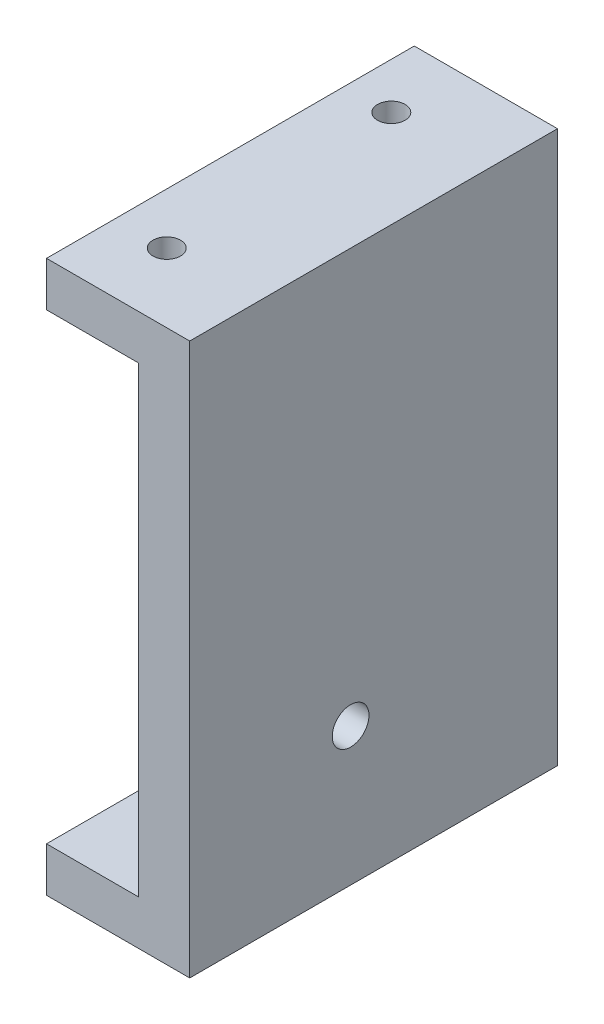
ISO-10303-21;
HEADER;
FILE_DESCRIPTION(('STEP AP214'),'2;1');
FILE_NAME('part.step','',(''),(''),'','','');
FILE_SCHEMA(('AUTOMOTIVE_DESIGN { 1 0 10303 214 1 1 1 1 }'));
ENDSEC;
DATA;
#1=APPLICATION_CONTEXT('core data for automotive mechanical design processes');
#2=APPLICATION_PROTOCOL_DEFINITION('international standard','automotive_design',2000,#1);
#3=PRODUCT_CONTEXT('',#1,'mechanical');
#4=PRODUCT('Part','Part','',(#3));
#5=PRODUCT_RELATED_PRODUCT_CATEGORY('part','',(#4));
#6=PRODUCT_DEFINITION_FORMATION('','',#4);
#7=PRODUCT_DEFINITION_CONTEXT('part definition',#1,'design');
#8=PRODUCT_DEFINITION('design','',#6,#7);
#9=PRODUCT_DEFINITION_SHAPE('','',#8);
#10=(LENGTH_UNIT() NAMED_UNIT(*) SI_UNIT(.MILLI.,.METRE.));
#11=(NAMED_UNIT(*) PLANE_ANGLE_UNIT() SI_UNIT($,.RADIAN.));
#12=(NAMED_UNIT(*) SI_UNIT($,.STERADIAN.) SOLID_ANGLE_UNIT());
#13=UNCERTAINTY_MEASURE_WITH_UNIT(LENGTH_MEASURE(1.E-05),#10,'distance_accuracy_value','');
#14=(GEOMETRIC_REPRESENTATION_CONTEXT(3) GLOBAL_UNCERTAINTY_ASSIGNED_CONTEXT((#13)) GLOBAL_UNIT_ASSIGNED_CONTEXT((#10,
#11,#12)) REPRESENTATION_CONTEXT('',''));
#15=CARTESIAN_POINT('',(0.,0.,0.));
#16=DIRECTION('',(0.,0.,1.));
#17=DIRECTION('',(1.,0.,0.));
#18=AXIS2_PLACEMENT_3D('',#15,#16,#17);
#19=CARTESIAN_POINT('',(0.,9.7062517048149,80.));
#20=DIRECTION('',(1.,0.,0.));
#21=DIRECTION('',(0.,0.,-1.));
#22=AXIS2_PLACEMENT_3D('',#19,#20,#21);
#23=PLANE('',#22);
#24=DIRECTION('',(0.,-1.,0.));
#25=VECTOR('',#24,1.);
#26=CARTESIAN_POINT('',(0.,9.7062517048149,0.));
#27=LINE('',#26,#25);
#28=CARTESIAN_POINT('',(0.,9.7062517048149,0.));
#29=VERTEX_POINT('',#28);
#30=CARTESIAN_POINT('',(0.,0.,0.));
#31=VERTEX_POINT('',#30);
#32=EDGE_CURVE('E131',#29,#31,#27,.T.);
#33=ORIENTED_EDGE('',*,*,#32,.T.);
#34=DIRECTION('',(0.,0.,-1.));
#35=VECTOR('',#34,1.);
#36=CARTESIAN_POINT('',(0.,0.,80.));
#37=LINE('',#36,#35);
#38=CARTESIAN_POINT('',(0.,0.,80.));
#39=VERTEX_POINT('',#38);
#40=EDGE_CURVE('E11',#39,#31,#37,.T.);
#41=ORIENTED_EDGE('',*,*,#40,.F.);
#42=DIRECTION('',(0.,-1.,0.));
#43=VECTOR('',#42,1.);
#44=CARTESIAN_POINT('',(0.,9.7062517048149,80.));
#45=LINE('',#44,#43);
#46=CARTESIAN_POINT('',(0.,9.7062517048149,80.));
#47=VERTEX_POINT('',#46);
#48=EDGE_CURVE('E146',#47,#39,#45,.T.);
#49=ORIENTED_EDGE('',*,*,#48,.F.);
#50=DIRECTION('',(0.,0.,-1.));
#51=VECTOR('',#50,1.);
#52=CARTESIAN_POINT('',(0.,9.7062517048149,80.));
#53=LINE('',#52,#51);
#54=EDGE_CURVE('E127',#47,#29,#53,.T.);
#55=ORIENTED_EDGE('',*,*,#54,.T.);
#56=EDGE_LOOP('',(#33,#41,#49,#55));
#57=FACE_BOUND('',#56,.T.);
#58=ADVANCED_FACE('F33',(#57),#23,.F.);
#59=CARTESIAN_POINT('',(0.,0.,80.));
#60=DIRECTION('',(0.,1.,0.));
#61=DIRECTION('',(0.,0.,1.));
#62=AXIS2_PLACEMENT_3D('',#59,#60,#61);
#63=PLANE('',#62);
#64=CARTESIAN_POINT('',(11.153008196666,0.,65.));
#65=DIRECTION('',(0.,1.,0.));
#66=DIRECTION('',(0.,0.,1.));
#67=AXIS2_PLACEMENT_3D('',#64,#65,#66);
#68=CIRCLE('',#67,2.99999999999997);
#69=CARTESIAN_POINT('',(11.153008196666,0.,68.));
#70=VERTEX_POINT('',#69);
#71=EDGE_CURVE('E318',#70,#70,#68,.T.);
#72=ORIENTED_EDGE('',*,*,#71,.T.);
#73=EDGE_LOOP('',(#72));
#74=FACE_BOUND('',#73,.T.);
#75=CARTESIAN_POINT('',(10.,0.,15.));
#76=DIRECTION('',(0.,1.,0.));
#77=DIRECTION('',(0.,0.,1.));
#78=AXIS2_PLACEMENT_3D('',#75,#76,#77);
#79=CIRCLE('',#78,2.99999999999997);
#80=CARTESIAN_POINT('',(10.,0.,18.));
#81=VERTEX_POINT('',#80);
#82=EDGE_CURVE('E159',#81,#81,#79,.T.);
#83=ORIENTED_EDGE('',*,*,#82,.T.);
#84=EDGE_LOOP('',(#83));
#85=FACE_BOUND('',#84,.T.);
#86=DIRECTION('',(1.,0.,0.));
#87=VECTOR('',#86,1.);
#88=CARTESIAN_POINT('',(0.,0.,0.));
#89=LINE('',#88,#87);
#90=CARTESIAN_POINT('',(31.153008196666,0.,0.));
#91=VERTEX_POINT('',#90);
#92=EDGE_CURVE('E134',#31,#91,#89,.T.);
#93=ORIENTED_EDGE('',*,*,#92,.T.);
#94=DIRECTION('',(0.,0.,-1.));
#95=VECTOR('',#94,1.);
#96=CARTESIAN_POINT('',(31.153008196666,0.,80.));
#97=LINE('',#96,#95);
#98=CARTESIAN_POINT('',(31.153008196666,0.,80.));
#99=VERTEX_POINT('',#98);
#100=EDGE_CURVE('E42',#99,#91,#97,.T.);
#101=ORIENTED_EDGE('',*,*,#100,.F.);
#102=DIRECTION('',(1.,0.,0.));
#103=VECTOR('',#102,1.);
#104=CARTESIAN_POINT('',(0.,0.,80.));
#105=LINE('',#104,#103);
#106=EDGE_CURVE('E94',#39,#99,#105,.T.);
#107=ORIENTED_EDGE('',*,*,#106,.F.);
#108=ORIENTED_EDGE('',*,*,#40,.T.);
#109=EDGE_LOOP('',(#93,#101,#107,#108));
#110=FACE_BOUND('',#109,.T.);
#111=ADVANCED_FACE('F212',(#74,#85,#110),#63,.F.);
#112=CARTESIAN_POINT('',(31.153008196666,0.,80.));
#113=DIRECTION('',(-1.,0.,0.));
#114=DIRECTION('',(0.,0.,1.));
#115=AXIS2_PLACEMENT_3D('',#112,#113,#114);
#116=PLANE('',#115);
#117=CARTESIAN_POINT('',(31.153008196666,30.,45.));
#118=DIRECTION('',(1.,0.,0.));
#119=DIRECTION('',(0.,0.,-1.));
#120=AXIS2_PLACEMENT_3D('',#117,#118,#119);
#121=CIRCLE('',#120,3.99999999999998);
#122=CARTESIAN_POINT('',(31.153008196666,30.,41.));
#123=VERTEX_POINT('',#122);
#124=EDGE_CURVE('E314',#123,#123,#121,.T.);
#125=ORIENTED_EDGE('',*,*,#124,.F.);
#126=EDGE_LOOP('',(#125));
#127=FACE_BOUND('',#126,.T.);
#128=DIRECTION('',(0.,1.,0.));
#129=VECTOR('',#128,1.);
#130=CARTESIAN_POINT('',(31.153008196666,0.,0.));
#131=LINE('',#130,#129);
#132=CARTESIAN_POINT('',(31.153008196666,120.,0.));
#133=VERTEX_POINT('',#132);
#134=EDGE_CURVE('E137',#91,#133,#131,.T.);
#135=ORIENTED_EDGE('',*,*,#134,.T.);
#136=DIRECTION('',(0.,0.,-1.));
#137=VECTOR('',#136,1.);
#138=CARTESIAN_POINT('',(31.153008196666,120.,80.));
#139=LINE('',#138,#137);
#140=CARTESIAN_POINT('',(31.153008196666,120.,80.));
#141=VERTEX_POINT('',#140);
#142=EDGE_CURVE('E153',#141,#133,#139,.T.);
#143=ORIENTED_EDGE('',*,*,#142,.F.);
#144=DIRECTION('',(0.,1.,0.));
#145=VECTOR('',#144,1.);
#146=CARTESIAN_POINT('',(31.153008196666,0.,80.));
#147=LINE('',#146,#145);
#148=EDGE_CURVE('E176',#99,#141,#147,.T.);
#149=ORIENTED_EDGE('',*,*,#148,.F.);
#150=ORIENTED_EDGE('',*,*,#100,.T.);
#151=EDGE_LOOP('',(#135,#143,#149,#150));
#152=FACE_BOUND('',#151,.T.);
#153=ADVANCED_FACE('F217',(#127,#152),#116,.F.);
#154=CARTESIAN_POINT('',(0.,120.,80.));
#155=DIRECTION('',(0.,-1.,0.));
#156=DIRECTION('',(0.,0.,-1.));
#157=AXIS2_PLACEMENT_3D('',#154,#155,#156);
#158=PLANE('',#157);
#159=CARTESIAN_POINT('',(11.153008196666,120.,65.));
#160=DIRECTION('',(0.,1.,0.));
#161=DIRECTION('',(0.,0.,1.));
#162=AXIS2_PLACEMENT_3D('',#159,#160,#161);
#163=CIRCLE('',#162,2.99999999999999);
#164=CARTESIAN_POINT('',(11.153008196666,120.,68.));
#165=VERTEX_POINT('',#164);
#166=EDGE_CURVE('E313',#165,#165,#163,.T.);
#167=ORIENTED_EDGE('',*,*,#166,.F.);
#168=EDGE_LOOP('',(#167));
#169=FACE_BOUND('',#168,.T.);
#170=CARTESIAN_POINT('',(10.,120.,15.));
#171=DIRECTION('',(0.,1.,0.));
#172=DIRECTION('',(0.,0.,1.));
#173=AXIS2_PLACEMENT_3D('',#170,#171,#172);
#174=CIRCLE('',#173,2.99999999999999);
#175=CARTESIAN_POINT('',(10.,120.,18.));
#176=VERTEX_POINT('',#175);
#177=EDGE_CURVE('E165',#176,#176,#174,.T.);
#178=ORIENTED_EDGE('',*,*,#177,.F.);
#179=EDGE_LOOP('',(#178));
#180=FACE_BOUND('',#179,.T.);
#181=DIRECTION('',(-1.,0.,0.));
#182=VECTOR('',#181,1.);
#183=CARTESIAN_POINT('',(0.,120.,0.));
#184=LINE('',#183,#182);
#185=CARTESIAN_POINT('',(0.,120.,0.));
#186=VERTEX_POINT('',#185);
#187=EDGE_CURVE('E139',#133,#186,#184,.T.);
#188=ORIENTED_EDGE('',*,*,#187,.T.);
#189=DIRECTION('',(0.,0.,-1.));
#190=VECTOR('',#189,1.);
#191=CARTESIAN_POINT('',(0.,120.,80.));
#192=LINE('',#191,#190);
#193=CARTESIAN_POINT('',(0.,120.,80.));
#194=VERTEX_POINT('',#193);
#195=EDGE_CURVE('E150',#194,#186,#192,.T.);
#196=ORIENTED_EDGE('',*,*,#195,.F.);
#197=DIRECTION('',(-1.,0.,0.));
#198=VECTOR('',#197,1.);
#199=CARTESIAN_POINT('',(0.,120.,80.));
#200=LINE('',#199,#198);
#201=EDGE_CURVE('E178',#141,#194,#200,.T.);
#202=ORIENTED_EDGE('',*,*,#201,.F.);
#203=ORIENTED_EDGE('',*,*,#142,.T.);
#204=EDGE_LOOP('',(#188,#196,#202,#203));
#205=FACE_BOUND('',#204,.T.);
#206=ADVANCED_FACE('F184',(#169,#180,#205),#158,.F.);
#207=CARTESIAN_POINT('',(0.,110.293748295185,80.));
#208=DIRECTION('',(1.,0.,0.));
#209=DIRECTION('',(0.,0.,-1.));
#210=AXIS2_PLACEMENT_3D('',#207,#208,#209);
#211=PLANE('',#210);
#212=DIRECTION('',(0.,-1.,0.));
#213=VECTOR('',#212,1.);
#214=CARTESIAN_POINT('',(0.,110.293748295185,0.));
#215=LINE('',#214,#213);
#216=CARTESIAN_POINT('',(0.,110.293748295185,0.));
#217=VERTEX_POINT('',#216);
#218=EDGE_CURVE('E141',#186,#217,#215,.T.);
#219=ORIENTED_EDGE('',*,*,#218,.T.);
#220=DIRECTION('',(0.,0.,-1.));
#221=VECTOR('',#220,1.);
#222=CARTESIAN_POINT('',(0.,110.293748295185,80.));
#223=LINE('',#222,#221);
#224=CARTESIAN_POINT('',(0.,110.293748295185,80.));
#225=VERTEX_POINT('',#224);
#226=EDGE_CURVE('E122',#225,#217,#223,.T.);
#227=ORIENTED_EDGE('',*,*,#226,.F.);
#228=DIRECTION('',(0.,-1.,0.));
#229=VECTOR('',#228,1.);
#230=CARTESIAN_POINT('',(0.,110.293748295185,80.));
#231=LINE('',#230,#229);
#232=EDGE_CURVE('E113',#194,#225,#231,.T.);
#233=ORIENTED_EDGE('',*,*,#232,.F.);
#234=ORIENTED_EDGE('',*,*,#195,.T.);
#235=EDGE_LOOP('',(#219,#227,#233,#234));
#236=FACE_BOUND('',#235,.T.);
#237=ADVANCED_FACE('F188',(#236),#211,.F.);
#238=CARTESIAN_POINT('',(20.,110.293748295185,80.));
#239=DIRECTION('',(0.,1.,0.));
#240=DIRECTION('',(-1.,0.,0.));
#241=AXIS2_PLACEMENT_3D('',#238,#239,#240);
#242=PLANE('',#241);
#243=CARTESIAN_POINT('',(11.153008196666,110.293748295185,65.));
#244=DIRECTION('',(0.,1.,0.));
#245=DIRECTION('',(-1.,0.,0.));
#246=AXIS2_PLACEMENT_3D('',#243,#244,#245);
#247=CIRCLE('',#246,2.99999999999998);
#248=CARTESIAN_POINT('',(8.15300819666606,110.293748295185,65.));
#249=VERTEX_POINT('',#248);
#250=EDGE_CURVE('E237',#249,#249,#247,.T.);
#251=ORIENTED_EDGE('',*,*,#250,.T.);
#252=EDGE_LOOP('',(#251));
#253=FACE_BOUND('',#252,.T.);
#254=CARTESIAN_POINT('',(10.,110.293748295185,15.));
#255=DIRECTION('',(0.,1.,0.));
#256=DIRECTION('',(-1.,0.,0.));
#257=AXIS2_PLACEMENT_3D('',#254,#255,#256);
#258=CIRCLE('',#257,2.99999999999998);
#259=CARTESIAN_POINT('',(7.00000000000002,110.293748295185,15.));
#260=VERTEX_POINT('',#259);
#261=EDGE_CURVE('E135',#260,#260,#258,.T.);
#262=ORIENTED_EDGE('',*,*,#261,.T.);
#263=EDGE_LOOP('',(#262));
#264=FACE_BOUND('',#263,.T.);
#265=DIRECTION('',(1.,0.,0.));
#266=VECTOR('',#265,1.);
#267=CARTESIAN_POINT('',(20.,110.293748295185,0.));
#268=LINE('',#267,#266);
#269=CARTESIAN_POINT('',(20.,110.293748295185,0.));
#270=VERTEX_POINT('',#269);
#271=EDGE_CURVE('E121',#217,#270,#268,.T.);
#272=ORIENTED_EDGE('',*,*,#271,.T.);
#273=DIRECTION('',(0.,0.,-1.));
#274=VECTOR('',#273,1.);
#275=CARTESIAN_POINT('',(20.,110.293748295185,80.));
#276=LINE('',#275,#274);
#277=CARTESIAN_POINT('',(20.,110.293748295185,80.));
#278=VERTEX_POINT('',#277);
#279=EDGE_CURVE('E118',#278,#270,#276,.T.);
#280=ORIENTED_EDGE('',*,*,#279,.F.);
#281=DIRECTION('',(1.,0.,0.));
#282=VECTOR('',#281,1.);
#283=CARTESIAN_POINT('',(20.,110.293748295185,80.));
#284=LINE('',#283,#282);
#285=EDGE_CURVE('E107',#225,#278,#284,.T.);
#286=ORIENTED_EDGE('',*,*,#285,.F.);
#287=ORIENTED_EDGE('',*,*,#226,.T.);
#288=EDGE_LOOP('',(#272,#280,#286,#287));
#289=FACE_BOUND('',#288,.T.);
#290=ADVANCED_FACE('F119',(#253,#264,#289),#242,.F.);
#291=CARTESIAN_POINT('',(20.,110.293748295185,80.));
#292=DIRECTION('',(1.,0.,0.));
#293=DIRECTION('',(0.,0.,-1.));
#294=AXIS2_PLACEMENT_3D('',#291,#292,#293);
#295=PLANE('',#294);
#296=CARTESIAN_POINT('',(20.,30.,45.));
#297=DIRECTION('',(1.,0.,0.));
#298=DIRECTION('',(0.,0.,-1.));
#299=AXIS2_PLACEMENT_3D('',#296,#297,#298);
#300=CIRCLE('',#299,3.99999999999998);
#301=CARTESIAN_POINT('',(20.,30.,41.));
#302=VERTEX_POINT('',#301);
#303=EDGE_CURVE('E170',#302,#302,#300,.T.);
#304=ORIENTED_EDGE('',*,*,#303,.T.);
#305=EDGE_LOOP('',(#304));
#306=FACE_BOUND('',#305,.T.);
#307=DIRECTION('',(0.,-1.,0.));
#308=VECTOR('',#307,1.);
#309=CARTESIAN_POINT('',(20.,110.293748295185,0.));
#310=LINE('',#309,#308);
#311=CARTESIAN_POINT('',(20.,9.7062517048149,0.));
#312=VERTEX_POINT('',#311);
#313=EDGE_CURVE('E80',#270,#312,#310,.T.);
#314=ORIENTED_EDGE('',*,*,#313,.T.);
#315=DIRECTION('',(0.,0.,-1.));
#316=VECTOR('',#315,1.);
#317=CARTESIAN_POINT('',(20.,9.7062517048149,80.));
#318=LINE('',#317,#316);
#319=CARTESIAN_POINT('',(20.,9.7062517048149,80.));
#320=VERTEX_POINT('',#319);
#321=EDGE_CURVE('E123',#320,#312,#318,.T.);
#322=ORIENTED_EDGE('',*,*,#321,.F.);
#323=DIRECTION('',(0.,-1.,0.));
#324=VECTOR('',#323,1.);
#325=CARTESIAN_POINT('',(20.,110.293748295185,80.));
#326=LINE('',#325,#324);
#327=EDGE_CURVE('E111',#278,#320,#326,.T.);
#328=ORIENTED_EDGE('',*,*,#327,.F.);
#329=ORIENTED_EDGE('',*,*,#279,.T.);
#330=EDGE_LOOP('',(#314,#322,#328,#329));
#331=FACE_BOUND('',#330,.T.);
#332=ADVANCED_FACE('F125',(#306,#331),#295,.F.);
#333=CARTESIAN_POINT('',(20.,9.7062517048149,80.));
#334=DIRECTION('',(0.,-1.,0.));
#335=DIRECTION('',(0.,0.,-1.));
#336=AXIS2_PLACEMENT_3D('',#333,#334,#335);
#337=PLANE('',#336);
#338=CARTESIAN_POINT('',(11.153008196666,9.7062517048149,65.));
#339=DIRECTION('',(0.,-1.,0.));
#340=DIRECTION('',(0.,0.,-1.));
#341=AXIS2_PLACEMENT_3D('',#338,#339,#340);
#342=CIRCLE('',#341,2.99999999999998);
#343=CARTESIAN_POINT('',(11.153008196666,9.7062517048149,62.));
#344=VERTEX_POINT('',#343);
#345=EDGE_CURVE('E36',#344,#344,#342,.T.);
#346=ORIENTED_EDGE('',*,*,#345,.T.);
#347=EDGE_LOOP('',(#346));
#348=FACE_BOUND('',#347,.T.);
#349=CARTESIAN_POINT('',(10.,9.7062517048149,15.));
#350=DIRECTION('',(0.,-1.,0.));
#351=DIRECTION('',(0.,0.,-1.));
#352=AXIS2_PLACEMENT_3D('',#349,#350,#351);
#353=CIRCLE('',#352,2.99999999999998);
#354=CARTESIAN_POINT('',(10.,9.7062517048149,12.));
#355=VERTEX_POINT('',#354);
#356=EDGE_CURVE('E157',#355,#355,#353,.T.);
#357=ORIENTED_EDGE('',*,*,#356,.T.);
#358=EDGE_LOOP('',(#357));
#359=FACE_BOUND('',#358,.T.);
#360=DIRECTION('',(-1.,0.,0.));
#361=VECTOR('',#360,1.);
#362=CARTESIAN_POINT('',(20.,9.7062517048149,0.));
#363=LINE('',#362,#361);
#364=EDGE_CURVE('E86',#312,#29,#363,.T.);
#365=ORIENTED_EDGE('',*,*,#364,.T.);
#366=ORIENTED_EDGE('',*,*,#54,.F.);
#367=DIRECTION('',(-1.,0.,0.));
#368=VECTOR('',#367,1.);
#369=CARTESIAN_POINT('',(20.,9.7062517048149,80.));
#370=LINE('',#369,#368);
#371=EDGE_CURVE('E51',#320,#47,#370,.T.);
#372=ORIENTED_EDGE('',*,*,#371,.F.);
#373=ORIENTED_EDGE('',*,*,#321,.T.);
#374=EDGE_LOOP('',(#365,#366,#372,#373));
#375=FACE_BOUND('',#374,.T.);
#376=ADVANCED_FACE('F196',(#348,#359,#375),#337,.F.);
#377=CARTESIAN_POINT('',(0.,0.,80.));
#378=DIRECTION('',(0.,0.,1.));
#379=DIRECTION('',(1.,0.,0.));
#380=AXIS2_PLACEMENT_3D('',#377,#378,#379);
#381=PLANE('',#380);
#382=ORIENTED_EDGE('',*,*,#48,.T.);
#383=ORIENTED_EDGE('',*,*,#106,.T.);
#384=ORIENTED_EDGE('',*,*,#148,.T.);
#385=ORIENTED_EDGE('',*,*,#201,.T.);
#386=ORIENTED_EDGE('',*,*,#232,.T.);
#387=ORIENTED_EDGE('',*,*,#285,.T.);
#388=ORIENTED_EDGE('',*,*,#327,.T.);
#389=ORIENTED_EDGE('',*,*,#371,.T.);
#390=EDGE_LOOP('',(#382,#383,#384,#385,#386,#387,#388,#389));
#391=FACE_BOUND('',#390,.T.);
#392=ADVANCED_FACE('F109',(#391),#381,.T.);
#393=CARTESIAN_POINT('',(0.,0.,0.));
#394=DIRECTION('',(0.,0.,1.));
#395=DIRECTION('',(1.,0.,0.));
#396=AXIS2_PLACEMENT_3D('',#393,#394,#395);
#397=PLANE('',#396);
#398=ORIENTED_EDGE('',*,*,#32,.F.);
#399=ORIENTED_EDGE('',*,*,#364,.F.);
#400=ORIENTED_EDGE('',*,*,#313,.F.);
#401=ORIENTED_EDGE('',*,*,#271,.F.);
#402=ORIENTED_EDGE('',*,*,#218,.F.);
#403=ORIENTED_EDGE('',*,*,#187,.F.);
#404=ORIENTED_EDGE('',*,*,#134,.F.);
#405=ORIENTED_EDGE('',*,*,#92,.F.);
#406=EDGE_LOOP('',(#398,#399,#400,#401,#402,#403,#404,#405));
#407=FACE_BOUND('',#406,.T.);
#408=ADVANCED_FACE('F191',(#407),#397,.F.);
#409=CARTESIAN_POINT('',(10.,120.,15.));
#410=DIRECTION('',(0.,1.,0.));
#411=DIRECTION('',(0.,0.,1.));
#412=AXIS2_PLACEMENT_3D('',#409,#410,#411);
#413=CYLINDRICAL_SURFACE('',#412,2.99999999999998);
#414=ORIENTED_EDGE('',*,*,#82,.F.);
#415=EDGE_LOOP('',(#414));
#416=FACE_BOUND('',#415,.T.);
#417=ORIENTED_EDGE('',*,*,#356,.F.);
#418=EDGE_LOOP('',(#417));
#419=FACE_BOUND('',#418,.T.);
#420=ADVANCED_FACE('F243',(#416,#419),#413,.F.);
#421=ORIENTED_EDGE('',*,*,#177,.T.);
#422=EDGE_LOOP('',(#421));
#423=FACE_BOUND('',#422,.T.);
#424=ORIENTED_EDGE('',*,*,#261,.F.);
#425=EDGE_LOOP('',(#424));
#426=FACE_BOUND('',#425,.T.);
#427=ADVANCED_FACE('F240',(#423,#426),#413,.F.);
#428=CARTESIAN_POINT('',(31.153008196666,30.,45.));
#429=DIRECTION('',(1.,0.,0.));
#430=DIRECTION('',(0.,0.,-1.));
#431=AXIS2_PLACEMENT_3D('',#428,#429,#430);
#432=CYLINDRICAL_SURFACE('',#431,3.99999999999998);
#433=ORIENTED_EDGE('',*,*,#124,.T.);
#434=EDGE_LOOP('',(#433));
#435=FACE_BOUND('',#434,.T.);
#436=ORIENTED_EDGE('',*,*,#303,.F.);
#437=EDGE_LOOP('',(#436));
#438=FACE_BOUND('',#437,.T.);
#439=ADVANCED_FACE('F242',(#435,#438),#432,.F.);
#440=CARTESIAN_POINT('',(11.153008196666,120.,65.));
#441=DIRECTION('',(0.,1.,0.));
#442=DIRECTION('',(0.,0.,1.));
#443=AXIS2_PLACEMENT_3D('',#440,#441,#442);
#444=CYLINDRICAL_SURFACE('',#443,2.99999999999998);
#445=ORIENTED_EDGE('',*,*,#71,.F.);
#446=EDGE_LOOP('',(#445));
#447=FACE_BOUND('',#446,.T.);
#448=ORIENTED_EDGE('',*,*,#345,.F.);
#449=EDGE_LOOP('',(#448));
#450=FACE_BOUND('',#449,.T.);
#451=ADVANCED_FACE('F250',(#447,#450),#444,.F.);
#452=ORIENTED_EDGE('',*,*,#166,.T.);
#453=EDGE_LOOP('',(#452));
#454=FACE_BOUND('',#453,.T.);
#455=ORIENTED_EDGE('',*,*,#250,.F.);
#456=EDGE_LOOP('',(#455));
#457=FACE_BOUND('',#456,.T.);
#458=ADVANCED_FACE('F298',(#454,#457),#444,.F.);
#459=CLOSED_SHELL('',(#58,#111,#153,#206,#237,#290,#332,#376,#392,#408,#420,#427,#439,#451,#458));
#460=MANIFOLD_SOLID_BREP('B2',#459);
#461=ADVANCED_BREP_SHAPE_REPRESENTATION('',(#18,#460),#14);
#462=SHAPE_DEFINITION_REPRESENTATION(#9,#461);
ENDSEC;
END-ISO-10303-21;
